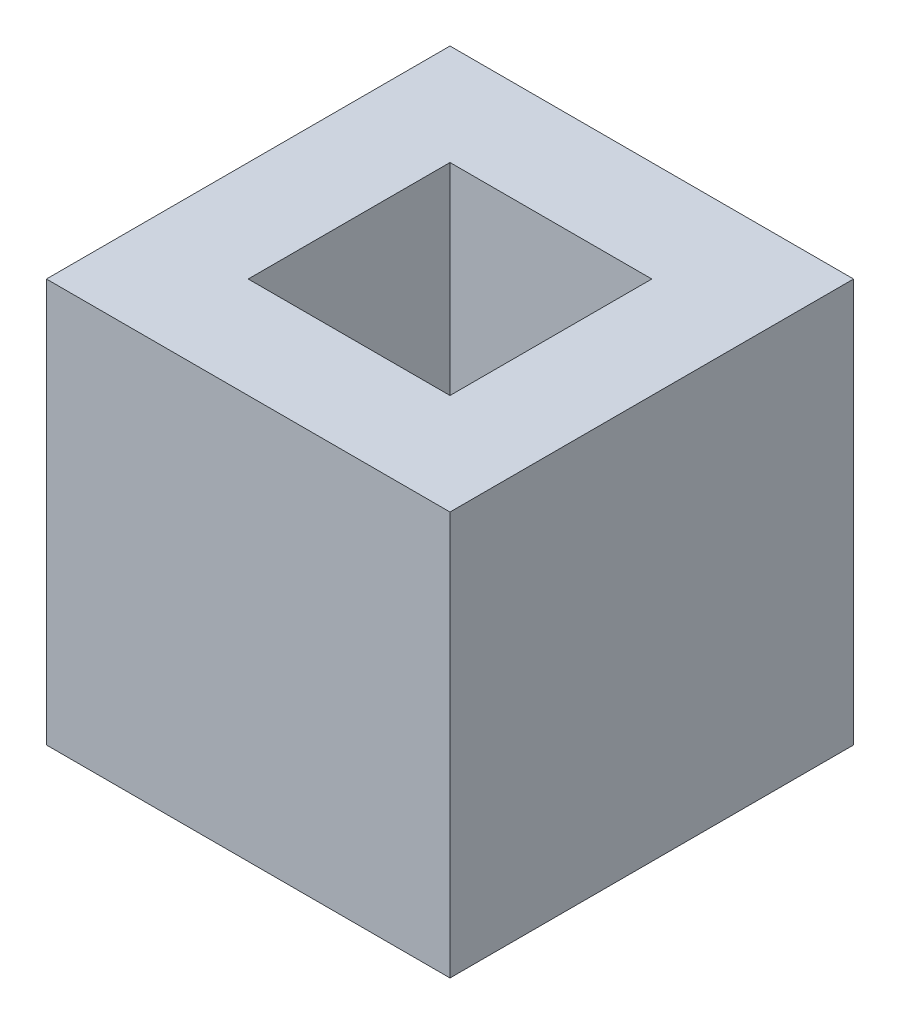
ISO-10303-21;
HEADER;
FILE_DESCRIPTION(('STEP AP214'),'2;1');
FILE_NAME('part.step','',(''),(''),'','','');
FILE_SCHEMA(('AUTOMOTIVE_DESIGN { 1 0 10303 214 1 1 1 1 }'));
ENDSEC;
DATA;
#1=APPLICATION_CONTEXT('core data for automotive mechanical design processes');
#2=APPLICATION_PROTOCOL_DEFINITION('international standard','automotive_design',2000,#1);
#3=PRODUCT_CONTEXT('',#1,'mechanical');
#4=PRODUCT('Part','Part','',(#3));
#5=PRODUCT_RELATED_PRODUCT_CATEGORY('part','',(#4));
#6=PRODUCT_DEFINITION_FORMATION('','',#4);
#7=PRODUCT_DEFINITION_CONTEXT('part definition',#1,'design');
#8=PRODUCT_DEFINITION('design','',#6,#7);
#9=PRODUCT_DEFINITION_SHAPE('','',#8);
#10=(LENGTH_UNIT() NAMED_UNIT(*) SI_UNIT(.MILLI.,.METRE.));
#11=(NAMED_UNIT(*) PLANE_ANGLE_UNIT() SI_UNIT($,.RADIAN.));
#12=(NAMED_UNIT(*) SI_UNIT($,.STERADIAN.) SOLID_ANGLE_UNIT());
#13=UNCERTAINTY_MEASURE_WITH_UNIT(LENGTH_MEASURE(1.E-05),#10,'distance_accuracy_value','');
#14=(GEOMETRIC_REPRESENTATION_CONTEXT(3) GLOBAL_UNCERTAINTY_ASSIGNED_CONTEXT((#13)) GLOBAL_UNIT_ASSIGNED_CONTEXT((#10,
#11,#12)) REPRESENTATION_CONTEXT('',''));
#15=CARTESIAN_POINT('',(0.,0.,0.));
#16=DIRECTION('',(0.,0.,1.));
#17=DIRECTION('',(1.,0.,0.));
#18=AXIS2_PLACEMENT_3D('',#15,#16,#17);
#19=CARTESIAN_POINT('',(0.,10.,0.));
#20=DIRECTION('',(0.,1.,0.));
#21=DIRECTION('',(0.,0.,1.));
#22=AXIS2_PLACEMENT_3D('',#19,#20,#21);
#23=PLANE('',#22);
#24=DIRECTION('',(0.,0.,-1.));
#25=VECTOR('',#24,1.);
#26=CARTESIAN_POINT('',(5.,10.,-5.));
#27=LINE('',#26,#25);
#28=CARTESIAN_POINT('',(5.,10.,5.));
#29=VERTEX_POINT('',#28);
#30=CARTESIAN_POINT('',(5.,10.,-5.));
#31=VERTEX_POINT('',#30);
#32=EDGE_CURVE('E153',#29,#31,#27,.T.);
#33=ORIENTED_EDGE('',*,*,#32,.T.);
#34=DIRECTION('',(-1.,0.,0.));
#35=VECTOR('',#34,1.);
#36=CARTESIAN_POINT('',(-5.,10.,-5.));
#37=LINE('',#36,#35);
#38=CARTESIAN_POINT('',(-5.,10.,-5.));
#39=VERTEX_POINT('',#38);
#40=EDGE_CURVE('E157',#31,#39,#37,.T.);
#41=ORIENTED_EDGE('',*,*,#40,.T.);
#42=DIRECTION('',(0.,0.,1.));
#43=VECTOR('',#42,1.);
#44=CARTESIAN_POINT('',(-5.,10.,-5.));
#45=LINE('',#44,#43);
#46=CARTESIAN_POINT('',(-5.,10.,5.));
#47=VERTEX_POINT('',#46);
#48=EDGE_CURVE('E161',#39,#47,#45,.T.);
#49=ORIENTED_EDGE('',*,*,#48,.T.);
#50=DIRECTION('',(1.,0.,0.));
#51=VECTOR('',#50,1.);
#52=CARTESIAN_POINT('',(-5.,10.,5.));
#53=LINE('',#52,#51);
#54=EDGE_CURVE('E164',#47,#29,#53,.T.);
#55=ORIENTED_EDGE('',*,*,#54,.T.);
#56=EDGE_LOOP('',(#33,#41,#49,#55));
#57=FACE_BOUND('',#56,.T.);
#58=DIRECTION('',(-1.,0.,0.));
#59=VECTOR('',#58,1.);
#60=CARTESIAN_POINT('',(-2.5,10.,-2.5));
#61=LINE('',#60,#59);
#62=CARTESIAN_POINT('',(2.5,10.,-2.5));
#63=VERTEX_POINT('',#62);
#64=CARTESIAN_POINT('',(-2.5,10.,-2.5));
#65=VERTEX_POINT('',#64);
#66=EDGE_CURVE('E114',#63,#65,#61,.T.);
#67=ORIENTED_EDGE('',*,*,#66,.F.);
#68=DIRECTION('',(0.,0.,-1.));
#69=VECTOR('',#68,1.);
#70=CARTESIAN_POINT('',(2.5,10.,-2.5));
#71=LINE('',#70,#69);
#72=CARTESIAN_POINT('',(2.5,10.,2.5));
#73=VERTEX_POINT('',#72);
#74=EDGE_CURVE('E105',#73,#63,#71,.T.);
#75=ORIENTED_EDGE('',*,*,#74,.F.);
#76=DIRECTION('',(1.,0.,0.));
#77=VECTOR('',#76,1.);
#78=CARTESIAN_POINT('',(-2.5,10.,2.5));
#79=LINE('',#78,#77);
#80=CARTESIAN_POINT('',(-2.5,10.,2.5));
#81=VERTEX_POINT('',#80);
#82=EDGE_CURVE('E131',#81,#73,#79,.T.);
#83=ORIENTED_EDGE('',*,*,#82,.F.);
#84=DIRECTION('',(0.,0.,1.));
#85=VECTOR('',#84,1.);
#86=CARTESIAN_POINT('',(-2.5,10.,-2.5));
#87=LINE('',#86,#85);
#88=EDGE_CURVE('E127',#65,#81,#87,.T.);
#89=ORIENTED_EDGE('',*,*,#88,.F.);
#90=EDGE_LOOP('',(#67,#75,#83,#89));
#91=FACE_BOUND('',#90,.T.);
#92=ADVANCED_FACE('F39',(#57,#91),#23,.T.);
#93=CARTESIAN_POINT('',(0.,0.,0.));
#94=DIRECTION('',(0.,1.,0.));
#95=DIRECTION('',(0.,0.,1.));
#96=AXIS2_PLACEMENT_3D('',#93,#94,#95);
#97=PLANE('',#96);
#98=DIRECTION('',(0.,0.,-1.));
#99=VECTOR('',#98,1.);
#100=CARTESIAN_POINT('',(5.,0.,-5.));
#101=LINE('',#100,#99);
#102=CARTESIAN_POINT('',(5.,0.,5.));
#103=VERTEX_POINT('',#102);
#104=CARTESIAN_POINT('',(5.,0.,-5.));
#105=VERTEX_POINT('',#104);
#106=EDGE_CURVE('E123',#103,#105,#101,.T.);
#107=ORIENTED_EDGE('',*,*,#106,.F.);
#108=DIRECTION('',(1.,0.,0.));
#109=VECTOR('',#108,1.);
#110=CARTESIAN_POINT('',(-5.,0.,5.));
#111=LINE('',#110,#109);
#112=CARTESIAN_POINT('',(-5.,0.,5.));
#113=VERTEX_POINT('',#112);
#114=EDGE_CURVE('E158',#113,#103,#111,.T.);
#115=ORIENTED_EDGE('',*,*,#114,.F.);
#116=DIRECTION('',(0.,0.,1.));
#117=VECTOR('',#116,1.);
#118=CARTESIAN_POINT('',(-5.,0.,-5.));
#119=LINE('',#118,#117);
#120=CARTESIAN_POINT('',(-5.,0.,-5.));
#121=VERTEX_POINT('',#120);
#122=EDGE_CURVE('E174',#121,#113,#119,.T.);
#123=ORIENTED_EDGE('',*,*,#122,.F.);
#124=DIRECTION('',(-1.,0.,0.));
#125=VECTOR('',#124,1.);
#126=CARTESIAN_POINT('',(-5.,0.,-5.));
#127=LINE('',#126,#125);
#128=EDGE_CURVE('E171',#105,#121,#127,.T.);
#129=ORIENTED_EDGE('',*,*,#128,.F.);
#130=EDGE_LOOP('',(#107,#115,#123,#129));
#131=FACE_BOUND('',#130,.T.);
#132=DIRECTION('',(0.,0.,-1.));
#133=VECTOR('',#132,1.);
#134=CARTESIAN_POINT('',(2.5,0.,-2.5));
#135=LINE('',#134,#133);
#136=CARTESIAN_POINT('',(2.5,0.,2.5));
#137=VERTEX_POINT('',#136);
#138=CARTESIAN_POINT('',(2.5,0.,-2.5));
#139=VERTEX_POINT('',#138);
#140=EDGE_CURVE('E63',#137,#139,#135,.T.);
#141=ORIENTED_EDGE('',*,*,#140,.T.);
#142=DIRECTION('',(-1.,0.,0.));
#143=VECTOR('',#142,1.);
#144=CARTESIAN_POINT('',(-2.5,0.,-2.5));
#145=LINE('',#144,#143);
#146=CARTESIAN_POINT('',(-2.5,0.,-2.5));
#147=VERTEX_POINT('',#146);
#148=EDGE_CURVE('E121',#139,#147,#145,.T.);
#149=ORIENTED_EDGE('',*,*,#148,.T.);
#150=DIRECTION('',(0.,0.,1.));
#151=VECTOR('',#150,1.);
#152=CARTESIAN_POINT('',(-2.5,0.,-2.5));
#153=LINE('',#152,#151);
#154=CARTESIAN_POINT('',(-2.5,0.,2.5));
#155=VERTEX_POINT('',#154);
#156=EDGE_CURVE('E140',#147,#155,#153,.T.);
#157=ORIENTED_EDGE('',*,*,#156,.T.);
#158=DIRECTION('',(1.,0.,0.));
#159=VECTOR('',#158,1.);
#160=CARTESIAN_POINT('',(-2.5,0.,2.5));
#161=LINE('',#160,#159);
#162=EDGE_CURVE('E115',#155,#137,#161,.T.);
#163=ORIENTED_EDGE('',*,*,#162,.T.);
#164=EDGE_LOOP('',(#141,#149,#157,#163));
#165=FACE_BOUND('',#164,.T.);
#166=ADVANCED_FACE('F197',(#131,#165),#97,.F.);
#167=CARTESIAN_POINT('',(5.,10.,-5.));
#168=DIRECTION('',(-1.,0.,0.));
#169=DIRECTION('',(0.,0.,1.));
#170=AXIS2_PLACEMENT_3D('',#167,#168,#169);
#171=PLANE('',#170);
#172=ORIENTED_EDGE('',*,*,#106,.T.);
#173=DIRECTION('',(0.,-1.,0.));
#174=VECTOR('',#173,1.);
#175=CARTESIAN_POINT('',(5.,10.,-5.));
#176=LINE('',#175,#174);
#177=EDGE_CURVE('E11',#31,#105,#176,.T.);
#178=ORIENTED_EDGE('',*,*,#177,.F.);
#179=ORIENTED_EDGE('',*,*,#32,.F.);
#180=DIRECTION('',(0.,-1.,0.));
#181=VECTOR('',#180,1.);
#182=CARTESIAN_POINT('',(5.,10.,5.));
#183=LINE('',#182,#181);
#184=EDGE_CURVE('E167',#29,#103,#183,.T.);
#185=ORIENTED_EDGE('',*,*,#184,.T.);
#186=EDGE_LOOP('',(#172,#178,#179,#185));
#187=FACE_BOUND('',#186,.T.);
#188=ADVANCED_FACE('F41',(#187),#171,.F.);
#189=CARTESIAN_POINT('',(-5.,10.,-5.));
#190=DIRECTION('',(0.,0.,1.));
#191=DIRECTION('',(1.,0.,0.));
#192=AXIS2_PLACEMENT_3D('',#189,#190,#191);
#193=PLANE('',#192);
#194=ORIENTED_EDGE('',*,*,#128,.T.);
#195=DIRECTION('',(0.,-1.,0.));
#196=VECTOR('',#195,1.);
#197=CARTESIAN_POINT('',(-5.,10.,-5.));
#198=LINE('',#197,#196);
#199=EDGE_CURVE('E48',#39,#121,#198,.T.);
#200=ORIENTED_EDGE('',*,*,#199,.F.);
#201=ORIENTED_EDGE('',*,*,#40,.F.);
#202=ORIENTED_EDGE('',*,*,#177,.T.);
#203=EDGE_LOOP('',(#194,#200,#201,#202));
#204=FACE_BOUND('',#203,.T.);
#205=ADVANCED_FACE('F207',(#204),#193,.F.);
#206=CARTESIAN_POINT('',(-5.,10.,-5.));
#207=DIRECTION('',(1.,0.,0.));
#208=DIRECTION('',(0.,0.,-1.));
#209=AXIS2_PLACEMENT_3D('',#206,#207,#208);
#210=PLANE('',#209);
#211=ORIENTED_EDGE('',*,*,#122,.T.);
#212=DIRECTION('',(0.,-1.,0.));
#213=VECTOR('',#212,1.);
#214=CARTESIAN_POINT('',(-5.,10.,5.));
#215=LINE('',#214,#213);
#216=EDGE_CURVE('E182',#47,#113,#215,.T.);
#217=ORIENTED_EDGE('',*,*,#216,.F.);
#218=ORIENTED_EDGE('',*,*,#48,.F.);
#219=ORIENTED_EDGE('',*,*,#199,.T.);
#220=EDGE_LOOP('',(#211,#217,#218,#219));
#221=FACE_BOUND('',#220,.T.);
#222=ADVANCED_FACE('F191',(#221),#210,.F.);
#223=CARTESIAN_POINT('',(-5.,10.,5.));
#224=DIRECTION('',(0.,0.,-1.));
#225=DIRECTION('',(-1.,0.,0.));
#226=AXIS2_PLACEMENT_3D('',#223,#224,#225);
#227=PLANE('',#226);
#228=ORIENTED_EDGE('',*,*,#114,.T.);
#229=ORIENTED_EDGE('',*,*,#184,.F.);
#230=ORIENTED_EDGE('',*,*,#54,.F.);
#231=ORIENTED_EDGE('',*,*,#216,.T.);
#232=EDGE_LOOP('',(#228,#229,#230,#231));
#233=FACE_BOUND('',#232,.T.);
#234=ADVANCED_FACE('F201',(#233),#227,.F.);
#235=CARTESIAN_POINT('',(2.5,10.,-2.5));
#236=DIRECTION('',(-1.,0.,0.));
#237=DIRECTION('',(0.,0.,1.));
#238=AXIS2_PLACEMENT_3D('',#235,#236,#237);
#239=PLANE('',#238);
#240=ORIENTED_EDGE('',*,*,#140,.F.);
#241=DIRECTION('',(0.,-1.,0.));
#242=VECTOR('',#241,1.);
#243=CARTESIAN_POINT('',(2.5,10.,2.5));
#244=LINE('',#243,#242);
#245=EDGE_CURVE('E109',#73,#137,#244,.T.);
#246=ORIENTED_EDGE('',*,*,#245,.F.);
#247=ORIENTED_EDGE('',*,*,#74,.T.);
#248=DIRECTION('',(0.,-1.,0.));
#249=VECTOR('',#248,1.);
#250=CARTESIAN_POINT('',(2.5,10.,-2.5));
#251=LINE('',#250,#249);
#252=EDGE_CURVE('E108',#63,#139,#251,.T.);
#253=ORIENTED_EDGE('',*,*,#252,.T.);
#254=EDGE_LOOP('',(#240,#246,#247,#253));
#255=FACE_BOUND('',#254,.T.);
#256=ADVANCED_FACE('F107',(#255),#239,.T.);
#257=CARTESIAN_POINT('',(-2.5,10.,-2.5));
#258=DIRECTION('',(0.,0.,1.));
#259=DIRECTION('',(1.,0.,0.));
#260=AXIS2_PLACEMENT_3D('',#257,#258,#259);
#261=PLANE('',#260);
#262=ORIENTED_EDGE('',*,*,#148,.F.);
#263=ORIENTED_EDGE('',*,*,#252,.F.);
#264=ORIENTED_EDGE('',*,*,#66,.T.);
#265=DIRECTION('',(0.,-1.,0.));
#266=VECTOR('',#265,1.);
#267=CARTESIAN_POINT('',(-2.5,10.,-2.5));
#268=LINE('',#267,#266);
#269=EDGE_CURVE('E124',#65,#147,#268,.T.);
#270=ORIENTED_EDGE('',*,*,#269,.T.);
#271=EDGE_LOOP('',(#262,#263,#264,#270));
#272=FACE_BOUND('',#271,.T.);
#273=ADVANCED_FACE('F118',(#272),#261,.T.);
#274=CARTESIAN_POINT('',(-2.5,10.,-2.5));
#275=DIRECTION('',(1.,0.,0.));
#276=DIRECTION('',(0.,0.,-1.));
#277=AXIS2_PLACEMENT_3D('',#274,#275,#276);
#278=PLANE('',#277);
#279=ORIENTED_EDGE('',*,*,#156,.F.);
#280=ORIENTED_EDGE('',*,*,#269,.F.);
#281=ORIENTED_EDGE('',*,*,#88,.T.);
#282=DIRECTION('',(0.,-1.,0.));
#283=VECTOR('',#282,1.);
#284=CARTESIAN_POINT('',(-2.5,10.,2.5));
#285=LINE('',#284,#283);
#286=EDGE_CURVE('E55',#81,#155,#285,.T.);
#287=ORIENTED_EDGE('',*,*,#286,.T.);
#288=EDGE_LOOP('',(#279,#280,#281,#287));
#289=FACE_BOUND('',#288,.T.);
#290=ADVANCED_FACE('F230',(#289),#278,.T.);
#291=CARTESIAN_POINT('',(-2.5,10.,2.5));
#292=DIRECTION('',(0.,0.,-1.));
#293=DIRECTION('',(-1.,0.,0.));
#294=AXIS2_PLACEMENT_3D('',#291,#292,#293);
#295=PLANE('',#294);
#296=ORIENTED_EDGE('',*,*,#162,.F.);
#297=ORIENTED_EDGE('',*,*,#286,.F.);
#298=ORIENTED_EDGE('',*,*,#82,.T.);
#299=ORIENTED_EDGE('',*,*,#245,.T.);
#300=EDGE_LOOP('',(#296,#297,#298,#299));
#301=FACE_BOUND('',#300,.T.);
#302=ADVANCED_FACE('F234',(#301),#295,.T.);
#303=CLOSED_SHELL('',(#92,#166,#188,#205,#222,#234,#256,#273,#290,#302));
#304=MANIFOLD_SOLID_BREP('B2',#303);
#305=ADVANCED_BREP_SHAPE_REPRESENTATION('',(#18,#304),#14);
#306=SHAPE_DEFINITION_REPRESENTATION(#9,#305);
ENDSEC;
END-ISO-10303-21;
